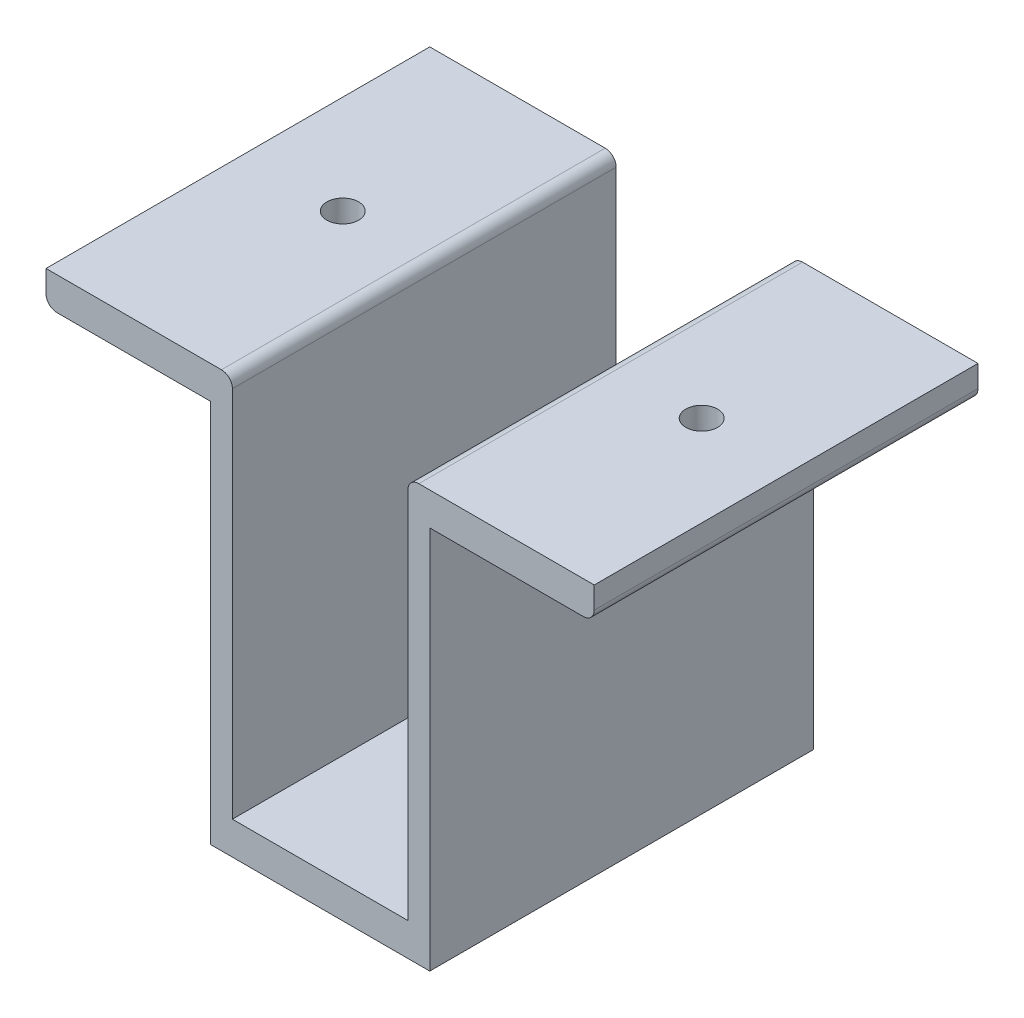
ISO-10303-21;
HEADER;
FILE_DESCRIPTION(('STEP AP214'),'2;1');
FILE_NAME('part.step','',(''),(''),'','','');
FILE_SCHEMA(('AUTOMOTIVE_DESIGN { 1 0 10303 214 1 1 1 1 }'));
ENDSEC;
DATA;
#1=APPLICATION_CONTEXT('core data for automotive mechanical design processes');
#2=APPLICATION_PROTOCOL_DEFINITION('international standard','automotive_design',2000,#1);
#3=PRODUCT_CONTEXT('',#1,'mechanical');
#4=PRODUCT('Part','Part','',(#3));
#5=PRODUCT_RELATED_PRODUCT_CATEGORY('part','',(#4));
#6=PRODUCT_DEFINITION_FORMATION('','',#4);
#7=PRODUCT_DEFINITION_CONTEXT('part definition',#1,'design');
#8=PRODUCT_DEFINITION('design','',#6,#7);
#9=PRODUCT_DEFINITION_SHAPE('','',#8);
#10=(LENGTH_UNIT() NAMED_UNIT(*) SI_UNIT(.MILLI.,.METRE.));
#11=(NAMED_UNIT(*) PLANE_ANGLE_UNIT() SI_UNIT($,.RADIAN.));
#12=(NAMED_UNIT(*) SI_UNIT($,.STERADIAN.) SOLID_ANGLE_UNIT());
#13=UNCERTAINTY_MEASURE_WITH_UNIT(LENGTH_MEASURE(1.E-05),#10,'distance_accuracy_value','');
#14=(GEOMETRIC_REPRESENTATION_CONTEXT(3) GLOBAL_UNCERTAINTY_ASSIGNED_CONTEXT((#13)) GLOBAL_UNIT_ASSIGNED_CONTEXT((#10,
#11,#12)) REPRESENTATION_CONTEXT('',''));
#15=CARTESIAN_POINT('',(0.,0.,0.));
#16=DIRECTION('',(0.,0.,1.));
#17=DIRECTION('',(1.,0.,0.));
#18=AXIS2_PLACEMENT_3D('',#15,#16,#17);
#19=CARTESIAN_POINT('',(0.,3.,0.));
#20=DIRECTION('',(0.,1.,0.));
#21=DIRECTION('',(0.,0.,1.));
#22=AXIS2_PLACEMENT_3D('',#19,#20,#21);
#23=PLANE('',#22);
#24=DIRECTION('',(0.,0.,1.));
#25=VECTOR('',#24,1.);
#26=CARTESIAN_POINT('',(17.9994477679851,3.,-19.887459807074));
#27=LINE('',#26,#25);
#28=CARTESIAN_POINT('',(17.9994477679851,3.,-17.8951929462717));
#29=VERTEX_POINT('',#28);
#30=CARTESIAN_POINT('',(17.9994477679851,3.,15.112540192926));
#31=VERTEX_POINT('',#30);
#32=EDGE_CURVE('E216',#29,#31,#27,.T.);
#33=ORIENTED_EDGE('',*,*,#32,.F.);
#34=DIRECTION('',(1.,0.,0.));
#35=VECTOR('',#34,1.);
#36=CARTESIAN_POINT('',(17.9994477679851,3.,-17.8951929462717));
#37=LINE('',#36,#35);
#38=CARTESIAN_POINT('',(2.,3.,-17.8951929462717));
#39=VERTEX_POINT('',#38);
#40=EDGE_CURVE('E263',#39,#29,#37,.T.);
#41=ORIENTED_EDGE('',*,*,#40,.F.);
#42=DIRECTION('',(0.,0.,-1.));
#43=VECTOR('',#42,1.);
#44=CARTESIAN_POINT('',(2.,3.,-19.887459807074));
#45=LINE('',#44,#43);
#46=CARTESIAN_POINT('',(2.,3.,15.112540192926));
#47=VERTEX_POINT('',#46);
#48=EDGE_CURVE('E186',#47,#39,#45,.T.);
#49=ORIENTED_EDGE('',*,*,#48,.F.);
#50=DIRECTION('',(1.,0.,0.));
#51=VECTOR('',#50,1.);
#52=CARTESIAN_POINT('',(0.,3.,15.112540192926));
#53=LINE('',#52,#51);
#54=EDGE_CURVE('E234',#47,#31,#53,.T.);
#55=ORIENTED_EDGE('',*,*,#54,.T.);
#56=EDGE_LOOP('',(#33,#41,#49,#55));
#57=FACE_BOUND('',#56,.T.);
#58=ADVANCED_FACE('F33',(#57),#23,.T.);
#59=CARTESIAN_POINT('',(2.,38.,-19.887459807074));
#60=DIRECTION('',(-1.,0.,0.));
#61=DIRECTION('',(0.,0.,1.));
#62=AXIS2_PLACEMENT_3D('',#59,#60,#61);
#63=PLANE('',#62);
#64=DIRECTION('',(0.,-1.,0.));
#65=VECTOR('',#64,1.);
#66=CARTESIAN_POINT('',(2.,38.,-19.887459807074));
#67=LINE('',#66,#65);
#68=CARTESIAN_POINT('',(2.,37.,-19.887459807074));
#69=VERTEX_POINT('',#68);
#70=CARTESIAN_POINT('',(2.,7.,-19.887459807074));
#71=VERTEX_POINT('',#70);
#72=EDGE_CURVE('E48',#69,#71,#67,.T.);
#73=ORIENTED_EDGE('',*,*,#72,.F.);
#74=DIRECTION('',(0.,0.,-1.));
#75=VECTOR('',#74,1.);
#76=CARTESIAN_POINT('',(2.,37.,15.112540192926));
#77=LINE('',#76,#75);
#78=CARTESIAN_POINT('',(2.,37.,15.112540192926));
#79=VERTEX_POINT('',#78);
#80=EDGE_CURVE('E294',#69,#79,#77,.F.);
#81=ORIENTED_EDGE('',*,*,#80,.T.);
#82=DIRECTION('',(0.,-1.,0.));
#83=VECTOR('',#82,1.);
#84=CARTESIAN_POINT('',(2.,38.,15.112540192926));
#85=LINE('',#84,#83);
#86=EDGE_CURVE('E231',#79,#47,#85,.T.);
#87=ORIENTED_EDGE('',*,*,#86,.T.);
#88=ORIENTED_EDGE('',*,*,#48,.T.);
#89=DIRECTION('',(0.,-1.,0.));
#90=VECTOR('',#89,1.);
#91=CARTESIAN_POINT('',(2.,8.,-17.8951929462717));
#92=LINE('',#91,#90);
#93=CARTESIAN_POINT('',(2.,8.,-17.8951929462717));
#94=VERTEX_POINT('',#93);
#95=EDGE_CURVE('E198',#94,#39,#92,.T.);
#96=ORIENTED_EDGE('',*,*,#95,.F.);
#97=DIRECTION('',(0.,0.,1.));
#98=VECTOR('',#97,1.);
#99=CARTESIAN_POINT('',(2.,8.,-19.887459807074));
#100=LINE('',#99,#98);
#101=CARTESIAN_POINT('',(2.,8.,-18.887459807074));
#102=VERTEX_POINT('',#101);
#103=EDGE_CURVE('E306',#102,#94,#100,.T.);
#104=ORIENTED_EDGE('',*,*,#103,.F.);
#105=CARTESIAN_POINT('',(2.,7.,-18.887459807074));
#106=DIRECTION('',(-1.,0.,0.));
#107=DIRECTION('',(0.,0.,1.));
#108=AXIS2_PLACEMENT_3D('',#105,#106,#107);
#109=CIRCLE('',#108,1.);
#110=EDGE_CURVE('E41',#102,#71,#109,.T.);
#111=ORIENTED_EDGE('',*,*,#110,.T.);
#112=EDGE_LOOP('',(#73,#81,#87,#88,#96,#104,#111));
#113=FACE_BOUND('',#112,.T.);
#114=ADVANCED_FACE('F303',(#113),#63,.F.);
#115=CARTESIAN_POINT('',(17.9994477679851,38.,-19.887459807074));
#116=DIRECTION('',(1.,0.,0.));
#117=DIRECTION('',(0.,0.,-1.));
#118=AXIS2_PLACEMENT_3D('',#115,#116,#117);
#119=PLANE('',#118);
#120=DIRECTION('',(0.,-1.,0.));
#121=VECTOR('',#120,1.);
#122=CARTESIAN_POINT('',(17.9994477679851,38.,15.112540192926));
#123=LINE('',#122,#121);
#124=CARTESIAN_POINT('',(17.9994477679851,37.,15.112540192926));
#125=VERTEX_POINT('',#124);
#126=EDGE_CURVE('E222',#125,#31,#123,.T.);
#127=ORIENTED_EDGE('',*,*,#126,.F.);
#128=DIRECTION('',(0.,0.,1.));
#129=VECTOR('',#128,1.);
#130=CARTESIAN_POINT('',(17.9994477679851,37.,-19.887459807074));
#131=LINE('',#130,#129);
#132=CARTESIAN_POINT('',(17.9994477679851,37.,-19.887459807074));
#133=VERTEX_POINT('',#132);
#134=EDGE_CURVE('E290',#125,#133,#131,.F.);
#135=ORIENTED_EDGE('',*,*,#134,.T.);
#136=DIRECTION('',(0.,-1.,0.));
#137=VECTOR('',#136,1.);
#138=CARTESIAN_POINT('',(17.9994477679851,38.,-19.887459807074));
#139=LINE('',#138,#137);
#140=CARTESIAN_POINT('',(17.9994477679851,7.,-19.887459807074));
#141=VERTEX_POINT('',#140);
#142=EDGE_CURVE('E55',#133,#141,#139,.T.);
#143=ORIENTED_EDGE('',*,*,#142,.T.);
#144=CARTESIAN_POINT('',(17.9994477679851,7.,-18.887459807074));
#145=DIRECTION('',(1.,0.,0.));
#146=DIRECTION('',(0.,0.,-1.));
#147=AXIS2_PLACEMENT_3D('',#144,#145,#146);
#148=CIRCLE('',#147,1.);
#149=CARTESIAN_POINT('',(17.9994477679851,8.,-18.887459807074));
#150=VERTEX_POINT('',#149);
#151=EDGE_CURVE('E11',#141,#150,#148,.T.);
#152=ORIENTED_EDGE('',*,*,#151,.T.);
#153=DIRECTION('',(0.,0.,-1.));
#154=VECTOR('',#153,1.);
#155=CARTESIAN_POINT('',(17.9994477679851,8.,-19.887459807074));
#156=LINE('',#155,#154);
#157=CARTESIAN_POINT('',(17.9994477679851,8.,-17.8951929462717));
#158=VERTEX_POINT('',#157);
#159=EDGE_CURVE('E367',#158,#150,#156,.T.);
#160=ORIENTED_EDGE('',*,*,#159,.F.);
#161=DIRECTION('',(0.,-1.,0.));
#162=VECTOR('',#161,1.);
#163=CARTESIAN_POINT('',(17.9994477679851,8.,-17.8951929462717));
#164=LINE('',#163,#162);
#165=EDGE_CURVE('E362',#158,#29,#164,.T.);
#166=ORIENTED_EDGE('',*,*,#165,.T.);
#167=ORIENTED_EDGE('',*,*,#32,.T.);
#168=EDGE_LOOP('',(#127,#135,#143,#152,#160,#166,#167));
#169=FACE_BOUND('',#168,.T.);
#170=ADVANCED_FACE('F399',(#169),#119,.F.);
#171=CARTESIAN_POINT('',(0.,3.,-19.887459807074));
#172=DIRECTION('',(1.,0.,0.));
#173=DIRECTION('',(0.,0.,-1.));
#174=AXIS2_PLACEMENT_3D('',#171,#172,#173);
#175=PLANE('',#174);
#176=DIRECTION('',(0.,0.,1.));
#177=VECTOR('',#176,1.);
#178=CARTESIAN_POINT('',(0.,35.0081400054375,-19.887459807074));
#179=LINE('',#178,#177);
#180=CARTESIAN_POINT('',(0.,35.0081400054375,-19.887459807074));
#181=VERTEX_POINT('',#180);
#182=CARTESIAN_POINT('',(0.,35.0081400054375,15.112540192926));
#183=VERTEX_POINT('',#182);
#184=EDGE_CURVE('E196',#181,#183,#179,.T.);
#185=ORIENTED_EDGE('',*,*,#184,.F.);
#186=DIRECTION('',(0.,-1.,0.));
#187=VECTOR('',#186,1.);
#188=CARTESIAN_POINT('',(0.,3.,-19.887459807074));
#189=LINE('',#188,#187);
#190=CARTESIAN_POINT('',(0.,0.,-19.887459807074));
#191=VERTEX_POINT('',#190);
#192=EDGE_CURVE('E237',#181,#191,#189,.T.);
#193=ORIENTED_EDGE('',*,*,#192,.T.);
#194=DIRECTION('',(0.,0.,1.));
#195=VECTOR('',#194,1.);
#196=CARTESIAN_POINT('',(0.,0.,-19.887459807074));
#197=LINE('',#196,#195);
#198=CARTESIAN_POINT('',(0.,0.,15.112540192926));
#199=VERTEX_POINT('',#198);
#200=EDGE_CURVE('E233',#191,#199,#197,.T.);
#201=ORIENTED_EDGE('',*,*,#200,.T.);
#202=DIRECTION('',(0.,-1.,0.));
#203=VECTOR('',#202,1.);
#204=CARTESIAN_POINT('',(0.,3.,15.112540192926));
#205=LINE('',#204,#203);
#206=EDGE_CURVE('E254',#183,#199,#205,.T.);
#207=ORIENTED_EDGE('',*,*,#206,.F.);
#208=EDGE_LOOP('',(#185,#193,#201,#207));
#209=FACE_BOUND('',#208,.T.);
#210=ADVANCED_FACE('F352',(#209),#175,.F.);
#211=CARTESIAN_POINT('',(20.,3.,-19.887459807074));
#212=DIRECTION('',(-1.,0.,0.));
#213=DIRECTION('',(0.,0.,1.));
#214=AXIS2_PLACEMENT_3D('',#211,#212,#213);
#215=PLANE('',#214);
#216=DIRECTION('',(0.,0.,-1.));
#217=VECTOR('',#216,1.);
#218=CARTESIAN_POINT('',(20.,35.0081400054375,15.112540192926));
#219=LINE('',#218,#217);
#220=CARTESIAN_POINT('',(20.,35.0081400054375,15.112540192926));
#221=VERTEX_POINT('',#220);
#222=CARTESIAN_POINT('',(20.,35.0081400054375,-19.887459807074));
#223=VERTEX_POINT('',#222);
#224=EDGE_CURVE('E201',#221,#223,#219,.T.);
#225=ORIENTED_EDGE('',*,*,#224,.F.);
#226=DIRECTION('',(0.,-1.,0.));
#227=VECTOR('',#226,1.);
#228=CARTESIAN_POINT('',(20.,3.,15.112540192926));
#229=LINE('',#228,#227);
#230=CARTESIAN_POINT('',(20.,0.,15.112540192926));
#231=VERTEX_POINT('',#230);
#232=EDGE_CURVE('E252',#221,#231,#229,.T.);
#233=ORIENTED_EDGE('',*,*,#232,.T.);
#234=DIRECTION('',(0.,0.,-1.));
#235=VECTOR('',#234,1.);
#236=CARTESIAN_POINT('',(20.,0.,-19.887459807074));
#237=LINE('',#236,#235);
#238=CARTESIAN_POINT('',(20.,0.,-19.887459807074));
#239=VERTEX_POINT('',#238);
#240=EDGE_CURVE('E244',#231,#239,#237,.T.);
#241=ORIENTED_EDGE('',*,*,#240,.T.);
#242=DIRECTION('',(0.,-1.,0.));
#243=VECTOR('',#242,1.);
#244=CARTESIAN_POINT('',(20.,3.,-19.887459807074));
#245=LINE('',#244,#243);
#246=EDGE_CURVE('E250',#223,#239,#245,.T.);
#247=ORIENTED_EDGE('',*,*,#246,.F.);
#248=EDGE_LOOP('',(#225,#233,#241,#247));
#249=FACE_BOUND('',#248,.T.);
#250=ADVANCED_FACE('F339',(#249),#215,.F.);
#251=CARTESIAN_POINT('',(0.,3.,15.112540192926));
#252=DIRECTION('',(0.,0.,-1.));
#253=DIRECTION('',(-1.,0.,0.));
#254=AXIS2_PLACEMENT_3D('',#251,#252,#253);
#255=PLANE('',#254);
#256=DIRECTION('',(0.,1.,0.));
#257=VECTOR('',#256,1.);
#258=CARTESIAN_POINT('',(-15.,38.,15.112540192926));
#259=LINE('',#258,#257);
#260=CARTESIAN_POINT('',(-15.,36.0081400054375,15.112540192926));
#261=VERTEX_POINT('',#260);
#262=CARTESIAN_POINT('',(-15.,38.,15.112540192926));
#263=VERTEX_POINT('',#262);
#264=EDGE_CURVE('E164',#261,#263,#259,.T.);
#265=ORIENTED_EDGE('',*,*,#264,.F.);
#266=CARTESIAN_POINT('',(-14.,36.0081400054375,15.112540192926));
#267=DIRECTION('',(0.,0.,-1.));
#268=DIRECTION('',(-1.,0.,0.));
#269=AXIS2_PLACEMENT_3D('',#266,#267,#268);
#270=CIRCLE('',#269,1.);
#271=CARTESIAN_POINT('',(-14.,35.0081400054375,15.112540192926));
#272=VERTEX_POINT('',#271);
#273=EDGE_CURVE('E270',#261,#272,#270,.F.);
#274=ORIENTED_EDGE('',*,*,#273,.T.);
#275=DIRECTION('',(1.,0.,0.));
#276=VECTOR('',#275,1.);
#277=CARTESIAN_POINT('',(-15.,35.0081400054375,15.112540192926));
#278=LINE('',#277,#276);
#279=EDGE_CURVE('E190',#272,#183,#278,.T.);
#280=ORIENTED_EDGE('',*,*,#279,.T.);
#281=ORIENTED_EDGE('',*,*,#206,.T.);
#282=DIRECTION('',(1.,0.,0.));
#283=VECTOR('',#282,1.);
#284=CARTESIAN_POINT('',(0.,0.,15.112540192926));
#285=LINE('',#284,#283);
#286=EDGE_CURVE('E241',#199,#231,#285,.T.);
#287=ORIENTED_EDGE('',*,*,#286,.T.);
#288=ORIENTED_EDGE('',*,*,#232,.F.);
#289=DIRECTION('',(-1.,0.,0.));
#290=VECTOR('',#289,1.);
#291=CARTESIAN_POINT('',(35.,35.0081400054375,15.112540192926));
#292=LINE('',#291,#290);
#293=CARTESIAN_POINT('',(34.,35.0081400054375,15.112540192926));
#294=VERTEX_POINT('',#293);
#295=EDGE_CURVE('E214',#294,#221,#292,.T.);
#296=ORIENTED_EDGE('',*,*,#295,.F.);
#297=CARTESIAN_POINT('',(34.,36.0081400054375,15.112540192926));
#298=DIRECTION('',(0.,0.,-1.));
#299=DIRECTION('',(-1.,0.,0.));
#300=AXIS2_PLACEMENT_3D('',#297,#298,#299);
#301=CIRCLE('',#300,1.);
#302=CARTESIAN_POINT('',(35.,36.0081400054375,15.112540192926));
#303=VERTEX_POINT('',#302);
#304=EDGE_CURVE('E268',#294,#303,#301,.F.);
#305=ORIENTED_EDGE('',*,*,#304,.T.);
#306=DIRECTION('',(0.,-1.,0.));
#307=VECTOR('',#306,1.);
#308=CARTESIAN_POINT('',(35.,38.,15.112540192926));
#309=LINE('',#308,#307);
#310=CARTESIAN_POINT('',(35.,38.,15.112540192926));
#311=VERTEX_POINT('',#310);
#312=EDGE_CURVE('E202',#311,#303,#309,.T.);
#313=ORIENTED_EDGE('',*,*,#312,.F.);
#314=DIRECTION('',(1.,0.,0.));
#315=VECTOR('',#314,1.);
#316=CARTESIAN_POINT('',(20.,38.,15.112540192926));
#317=LINE('',#316,#315);
#318=CARTESIAN_POINT('',(18.9994477679851,38.,15.112540192926));
#319=VERTEX_POINT('',#318);
#320=EDGE_CURVE('E220',#319,#311,#317,.T.);
#321=ORIENTED_EDGE('',*,*,#320,.F.);
#322=CARTESIAN_POINT('',(18.9994477679851,37.,15.112540192926));
#323=DIRECTION('',(0.,0.,-1.));
#324=DIRECTION('',(-1.,0.,0.));
#325=AXIS2_PLACEMENT_3D('',#322,#323,#324);
#326=CIRCLE('',#325,1.);
#327=EDGE_CURVE('E266',#319,#125,#326,.F.);
#328=ORIENTED_EDGE('',*,*,#327,.T.);
#329=ORIENTED_EDGE('',*,*,#126,.T.);
#330=ORIENTED_EDGE('',*,*,#54,.F.);
#331=ORIENTED_EDGE('',*,*,#86,.F.);
#332=CARTESIAN_POINT('',(1.,37.,15.112540192926));
#333=DIRECTION('',(0.,0.,-1.));
#334=DIRECTION('',(-1.,0.,0.));
#335=AXIS2_PLACEMENT_3D('',#332,#333,#334);
#336=CIRCLE('',#335,1.);
#337=CARTESIAN_POINT('',(1.,38.,15.112540192926));
#338=VERTEX_POINT('',#337);
#339=EDGE_CURVE('E181',#79,#338,#336,.F.);
#340=ORIENTED_EDGE('',*,*,#339,.T.);
#341=DIRECTION('',(1.,0.,0.));
#342=VECTOR('',#341,1.);
#343=CARTESIAN_POINT('',(0.,38.,15.112540192926));
#344=LINE('',#343,#342);
#345=EDGE_CURVE('E177',#263,#338,#344,.T.);
#346=ORIENTED_EDGE('',*,*,#345,.F.);
#347=EDGE_LOOP('',(#265,#274,#280,#281,#287,#288,#296,#305,#313,#321,#328,#329,#330,#331,#340,#346));
#348=FACE_BOUND('',#347,.T.);
#349=ADVANCED_FACE('F178',(#348),#255,.F.);
#350=CARTESIAN_POINT('',(0.,3.,-19.887459807074));
#351=DIRECTION('',(0.,0.,1.));
#352=DIRECTION('',(1.,0.,0.));
#353=AXIS2_PLACEMENT_3D('',#350,#351,#352);
#354=PLANE('',#353);
#355=ORIENTED_EDGE('',*,*,#72,.T.);
#356=DIRECTION('',(-1.,0.,0.));
#357=VECTOR('',#356,1.);
#358=CARTESIAN_POINT('',(0.,7.,-19.887459807074));
#359=LINE('',#358,#357);
#360=EDGE_CURVE('E299',#71,#141,#359,.F.);
#361=ORIENTED_EDGE('',*,*,#360,.T.);
#362=ORIENTED_EDGE('',*,*,#142,.F.);
#363=CARTESIAN_POINT('',(18.9994477679851,37.,-19.887459807074));
#364=DIRECTION('',(0.,0.,1.));
#365=DIRECTION('',(1.,0.,0.));
#366=AXIS2_PLACEMENT_3D('',#363,#364,#365);
#367=CIRCLE('',#366,1.);
#368=CARTESIAN_POINT('',(18.9994477679851,38.,-19.887459807074));
#369=VERTEX_POINT('',#368);
#370=EDGE_CURVE('E276',#133,#369,#367,.F.);
#371=ORIENTED_EDGE('',*,*,#370,.T.);
#372=DIRECTION('',(-1.,0.,0.));
#373=VECTOR('',#372,1.);
#374=CARTESIAN_POINT('',(20.,38.,-19.887459807074));
#375=LINE('',#374,#373);
#376=CARTESIAN_POINT('',(35.,38.,-19.887459807074));
#377=VERTEX_POINT('',#376);
#378=EDGE_CURVE('E217',#377,#369,#375,.T.);
#379=ORIENTED_EDGE('',*,*,#378,.F.);
#380=DIRECTION('',(0.,1.,0.));
#381=VECTOR('',#380,1.);
#382=CARTESIAN_POINT('',(35.,38.,-19.887459807074));
#383=LINE('',#382,#381);
#384=CARTESIAN_POINT('',(35.,36.0081400054375,-19.887459807074));
#385=VERTEX_POINT('',#384);
#386=EDGE_CURVE('E205',#385,#377,#383,.T.);
#387=ORIENTED_EDGE('',*,*,#386,.F.);
#388=CARTESIAN_POINT('',(34.,36.0081400054375,-19.887459807074));
#389=DIRECTION('',(0.,0.,1.));
#390=DIRECTION('',(1.,0.,0.));
#391=AXIS2_PLACEMENT_3D('',#388,#389,#390);
#392=CIRCLE('',#391,1.);
#393=CARTESIAN_POINT('',(34.,35.0081400054375,-19.887459807074));
#394=VERTEX_POINT('',#393);
#395=EDGE_CURVE('E278',#385,#394,#392,.F.);
#396=ORIENTED_EDGE('',*,*,#395,.T.);
#397=DIRECTION('',(-1.,0.,0.));
#398=VECTOR('',#397,1.);
#399=CARTESIAN_POINT('',(35.,35.0081400054375,-19.887459807074));
#400=LINE('',#399,#398);
#401=EDGE_CURVE('E210',#394,#223,#400,.T.);
#402=ORIENTED_EDGE('',*,*,#401,.T.);
#403=ORIENTED_EDGE('',*,*,#246,.T.);
#404=DIRECTION('',(-1.,0.,0.));
#405=VECTOR('',#404,1.);
#406=CARTESIAN_POINT('',(0.,0.,-19.887459807074));
#407=LINE('',#406,#405);
#408=EDGE_CURVE('E238',#239,#191,#407,.T.);
#409=ORIENTED_EDGE('',*,*,#408,.T.);
#410=ORIENTED_EDGE('',*,*,#192,.F.);
#411=DIRECTION('',(1.,0.,0.));
#412=VECTOR('',#411,1.);
#413=CARTESIAN_POINT('',(-15.,35.0081400054375,-19.887459807074));
#414=LINE('',#413,#412);
#415=CARTESIAN_POINT('',(-14.,35.0081400054375,-19.887459807074));
#416=VERTEX_POINT('',#415);
#417=EDGE_CURVE('E192',#416,#181,#414,.T.);
#418=ORIENTED_EDGE('',*,*,#417,.F.);
#419=CARTESIAN_POINT('',(-14.,36.0081400054375,-19.887459807074));
#420=DIRECTION('',(0.,0.,1.));
#421=DIRECTION('',(1.,0.,0.));
#422=AXIS2_PLACEMENT_3D('',#419,#420,#421);
#423=CIRCLE('',#422,1.);
#424=CARTESIAN_POINT('',(-15.,36.0081400054375,-19.887459807074));
#425=VERTEX_POINT('',#424);
#426=EDGE_CURVE('E280',#416,#425,#423,.F.);
#427=ORIENTED_EDGE('',*,*,#426,.T.);
#428=DIRECTION('',(0.,-1.,0.));
#429=VECTOR('',#428,1.);
#430=CARTESIAN_POINT('',(-15.,38.,-19.887459807074));
#431=LINE('',#430,#429);
#432=CARTESIAN_POINT('',(-15.,38.,-19.887459807074));
#433=VERTEX_POINT('',#432);
#434=EDGE_CURVE('E174',#433,#425,#431,.T.);
#435=ORIENTED_EDGE('',*,*,#434,.F.);
#436=DIRECTION('',(-1.,0.,0.));
#437=VECTOR('',#436,1.);
#438=CARTESIAN_POINT('',(0.,38.,-19.887459807074));
#439=LINE('',#438,#437);
#440=CARTESIAN_POINT('',(1.,38.,-19.887459807074));
#441=VERTEX_POINT('',#440);
#442=EDGE_CURVE('E185',#441,#433,#439,.T.);
#443=ORIENTED_EDGE('',*,*,#442,.F.);
#444=CARTESIAN_POINT('',(1.,37.,-19.887459807074));
#445=DIRECTION('',(0.,0.,1.));
#446=DIRECTION('',(1.,0.,0.));
#447=AXIS2_PLACEMENT_3D('',#444,#445,#446);
#448=CIRCLE('',#447,1.);
#449=EDGE_CURVE('E274',#441,#69,#448,.F.);
#450=ORIENTED_EDGE('',*,*,#449,.T.);
#451=EDGE_LOOP('',(#355,#361,#362,#371,#379,#387,#396,#402,#403,#409,#410,#418,#427,#435,#443,#450));
#452=FACE_BOUND('',#451,.T.);
#453=ADVANCED_FACE('F310',(#452),#354,.F.);
#454=CARTESIAN_POINT('',(0.,0.,0.));
#455=DIRECTION('',(0.,1.,0.));
#456=DIRECTION('',(0.,0.,1.));
#457=AXIS2_PLACEMENT_3D('',#454,#455,#456);
#458=PLANE('',#457);
#459=ORIENTED_EDGE('',*,*,#200,.F.);
#460=ORIENTED_EDGE('',*,*,#408,.F.);
#461=ORIENTED_EDGE('',*,*,#240,.F.);
#462=ORIENTED_EDGE('',*,*,#286,.F.);
#463=EDGE_LOOP('',(#459,#460,#461,#462));
#464=FACE_BOUND('',#463,.T.);
#465=ADVANCED_FACE('F346',(#464),#458,.F.);
#466=CARTESIAN_POINT('',(0.,38.,0.));
#467=DIRECTION('',(0.,1.,0.));
#468=DIRECTION('',(0.,0.,1.));
#469=AXIS2_PLACEMENT_3D('',#466,#467,#468);
#470=PLANE('',#469);
#471=CARTESIAN_POINT('',(-6.00207216619672,38.,-2.95549309832886));
#472=DIRECTION('',(0.,1.,0.));
#473=DIRECTION('',(0.,0.,1.));
#474=AXIS2_PLACEMENT_3D('',#471,#472,#473);
#475=CIRCLE('',#474,1.45);
#476=CARTESIAN_POINT('',(-6.00207216619672,38.,-1.50549309832886));
#477=VERTEX_POINT('',#476);
#478=EDGE_CURVE('E260',#477,#477,#475,.T.);
#479=ORIENTED_EDGE('',*,*,#478,.F.);
#480=EDGE_LOOP('',(#479));
#481=FACE_BOUND('',#480,.T.);
#482=ORIENTED_EDGE('',*,*,#345,.T.);
#483=DIRECTION('',(0.,0.,-1.));
#484=VECTOR('',#483,1.);
#485=CARTESIAN_POINT('',(1.,38.,-19.887459807074));
#486=LINE('',#485,#484);
#487=EDGE_CURVE('E292',#338,#441,#486,.T.);
#488=ORIENTED_EDGE('',*,*,#487,.T.);
#489=ORIENTED_EDGE('',*,*,#442,.T.);
#490=DIRECTION('',(0.,0.,-1.));
#491=VECTOR('',#490,1.);
#492=CARTESIAN_POINT('',(-15.,38.,-19.887459807074));
#493=LINE('',#492,#491);
#494=EDGE_CURVE('E169',#263,#433,#493,.T.);
#495=ORIENTED_EDGE('',*,*,#494,.F.);
#496=EDGE_LOOP('',(#482,#488,#489,#495));
#497=FACE_BOUND('',#496,.T.);
#498=ADVANCED_FACE('F188',(#481,#497),#470,.T.);
#499=CARTESIAN_POINT('',(0.,38.,0.));
#500=DIRECTION('',(0.,-1.,0.));
#501=DIRECTION('',(0.,0.,-1.));
#502=AXIS2_PLACEMENT_3D('',#499,#500,#501);
#503=PLANE('',#502);
#504=CARTESIAN_POINT('',(26.7304321433144,38.,-2.95549309832886));
#505=DIRECTION('',(0.,1.,0.));
#506=DIRECTION('',(0.,0.,1.));
#507=AXIS2_PLACEMENT_3D('',#504,#505,#506);
#508=CIRCLE('',#507,1.45);
#509=CARTESIAN_POINT('',(26.7304321433144,38.,-1.50549309832886));
#510=VERTEX_POINT('',#509);
#511=EDGE_CURVE('E373',#510,#510,#508,.T.);
#512=ORIENTED_EDGE('',*,*,#511,.F.);
#513=EDGE_LOOP('',(#512));
#514=FACE_BOUND('',#513,.T.);
#515=ORIENTED_EDGE('',*,*,#378,.T.);
#516=DIRECTION('',(0.,0.,1.));
#517=VECTOR('',#516,1.);
#518=CARTESIAN_POINT('',(18.9994477679851,38.,0.));
#519=LINE('',#518,#517);
#520=EDGE_CURVE('E287',#369,#319,#519,.T.);
#521=ORIENTED_EDGE('',*,*,#520,.T.);
#522=ORIENTED_EDGE('',*,*,#320,.T.);
#523=DIRECTION('',(0.,0.,1.));
#524=VECTOR('',#523,1.);
#525=CARTESIAN_POINT('',(35.,38.,15.112540192926));
#526=LINE('',#525,#524);
#527=EDGE_CURVE('E207',#377,#311,#526,.T.);
#528=ORIENTED_EDGE('',*,*,#527,.F.);
#529=EDGE_LOOP('',(#515,#521,#522,#528));
#530=FACE_BOUND('',#529,.T.);
#531=ADVANCED_FACE('F319',(#514,#530),#503,.F.);
#532=CARTESIAN_POINT('',(35.,35.0081400054375,15.112540192926));
#533=DIRECTION('',(0.,1.,0.));
#534=DIRECTION('',(0.,0.,1.));
#535=AXIS2_PLACEMENT_3D('',#532,#533,#534);
#536=PLANE('',#535);
#537=CARTESIAN_POINT('',(26.7304321433144,35.0081400054375,-2.95549309832886));
#538=DIRECTION('',(0.,1.,0.));
#539=DIRECTION('',(0.,0.,1.));
#540=AXIS2_PLACEMENT_3D('',#537,#538,#539);
#541=CIRCLE('',#540,1.45);
#542=CARTESIAN_POINT('',(26.7304321433144,35.0081400054375,-1.50549309832886));
#543=VERTEX_POINT('',#542);
#544=EDGE_CURVE('E259',#543,#543,#541,.T.);
#545=ORIENTED_EDGE('',*,*,#544,.T.);
#546=EDGE_LOOP('',(#545));
#547=FACE_BOUND('',#546,.T.);
#548=ORIENTED_EDGE('',*,*,#401,.F.);
#549=DIRECTION('',(0.,0.,-1.));
#550=VECTOR('',#549,1.);
#551=CARTESIAN_POINT('',(34.,35.0081400054375,15.112540192926));
#552=LINE('',#551,#550);
#553=EDGE_CURVE('E285',#394,#294,#552,.F.);
#554=ORIENTED_EDGE('',*,*,#553,.T.);
#555=ORIENTED_EDGE('',*,*,#295,.T.);
#556=ORIENTED_EDGE('',*,*,#224,.T.);
#557=EDGE_LOOP('',(#548,#554,#555,#556));
#558=FACE_BOUND('',#557,.T.);
#559=ADVANCED_FACE('F335',(#547,#558),#536,.F.);
#560=CARTESIAN_POINT('',(35.,0.,0.));
#561=DIRECTION('',(1.,0.,0.));
#562=DIRECTION('',(0.,0.,-1.));
#563=AXIS2_PLACEMENT_3D('',#560,#561,#562);
#564=PLANE('',#563);
#565=ORIENTED_EDGE('',*,*,#312,.T.);
#566=DIRECTION('',(0.,0.,-1.));
#567=VECTOR('',#566,1.);
#568=CARTESIAN_POINT('',(35.,36.0081400054375,-19.887459807074));
#569=LINE('',#568,#567);
#570=EDGE_CURVE('E282',#303,#385,#569,.T.);
#571=ORIENTED_EDGE('',*,*,#570,.T.);
#572=ORIENTED_EDGE('',*,*,#386,.T.);
#573=ORIENTED_EDGE('',*,*,#527,.T.);
#574=EDGE_LOOP('',(#565,#571,#572,#573));
#575=FACE_BOUND('',#574,.T.);
#576=ADVANCED_FACE('F327',(#575),#564,.T.);
#577=CARTESIAN_POINT('',(-15.,35.0081400054375,-19.887459807074));
#578=DIRECTION('',(0.,1.,0.));
#579=DIRECTION('',(0.,0.,1.));
#580=AXIS2_PLACEMENT_3D('',#577,#578,#579);
#581=PLANE('',#580);
#582=CARTESIAN_POINT('',(-6.00207216619672,35.0081400054375,-2.95549309832886));
#583=DIRECTION('',(0.,1.,0.));
#584=DIRECTION('',(0.,0.,1.));
#585=AXIS2_PLACEMENT_3D('',#582,#583,#584);
#586=CIRCLE('',#585,1.45);
#587=CARTESIAN_POINT('',(-6.00207216619672,35.0081400054375,-1.50549309832886));
#588=VERTEX_POINT('',#587);
#589=EDGE_CURVE('E256',#588,#588,#586,.T.);
#590=ORIENTED_EDGE('',*,*,#589,.T.);
#591=EDGE_LOOP('',(#590));
#592=FACE_BOUND('',#591,.T.);
#593=ORIENTED_EDGE('',*,*,#279,.F.);
#594=DIRECTION('',(0.,0.,1.));
#595=VECTOR('',#594,1.);
#596=CARTESIAN_POINT('',(-14.,35.0081400054375,-19.887459807074));
#597=LINE('',#596,#595);
#598=EDGE_CURVE('E272',#272,#416,#597,.F.);
#599=ORIENTED_EDGE('',*,*,#598,.T.);
#600=ORIENTED_EDGE('',*,*,#417,.T.);
#601=ORIENTED_EDGE('',*,*,#184,.T.);
#602=EDGE_LOOP('',(#593,#599,#600,#601));
#603=FACE_BOUND('',#602,.T.);
#604=ADVANCED_FACE('F355',(#592,#603),#581,.F.);
#605=CARTESIAN_POINT('',(-15.,0.,0.));
#606=DIRECTION('',(-1.,0.,0.));
#607=DIRECTION('',(0.,0.,1.));
#608=AXIS2_PLACEMENT_3D('',#605,#606,#607);
#609=PLANE('',#608);
#610=ORIENTED_EDGE('',*,*,#434,.T.);
#611=DIRECTION('',(0.,0.,1.));
#612=VECTOR('',#611,1.);
#613=CARTESIAN_POINT('',(-15.,36.0081400054375,15.112540192926));
#614=LINE('',#613,#612);
#615=EDGE_CURVE('E172',#425,#261,#614,.T.);
#616=ORIENTED_EDGE('',*,*,#615,.T.);
#617=ORIENTED_EDGE('',*,*,#264,.T.);
#618=ORIENTED_EDGE('',*,*,#494,.T.);
#619=EDGE_LOOP('',(#610,#616,#617,#618));
#620=FACE_BOUND('',#619,.T.);
#621=ADVANCED_FACE('F167',(#620),#609,.T.);
#622=CARTESIAN_POINT('',(17.9994477679851,8.,-17.8951929462717));
#623=DIRECTION('',(0.,0.,-1.));
#624=DIRECTION('',(-1.,0.,0.));
#625=AXIS2_PLACEMENT_3D('',#622,#623,#624);
#626=PLANE('',#625);
#627=ORIENTED_EDGE('',*,*,#40,.T.);
#628=ORIENTED_EDGE('',*,*,#165,.F.);
#629=DIRECTION('',(1.,0.,0.));
#630=VECTOR('',#629,1.);
#631=CARTESIAN_POINT('',(17.9994477679851,8.,-17.8951929462717));
#632=LINE('',#631,#630);
#633=EDGE_CURVE('E364',#94,#158,#632,.T.);
#634=ORIENTED_EDGE('',*,*,#633,.F.);
#635=ORIENTED_EDGE('',*,*,#95,.T.);
#636=EDGE_LOOP('',(#627,#628,#634,#635));
#637=FACE_BOUND('',#636,.T.);
#638=ADVANCED_FACE('F426',(#637),#626,.F.);
#639=CARTESIAN_POINT('',(0.,8.,0.));
#640=DIRECTION('',(0.,-1.,0.));
#641=DIRECTION('',(0.,0.,-1.));
#642=AXIS2_PLACEMENT_3D('',#639,#640,#641);
#643=PLANE('',#642);
#644=ORIENTED_EDGE('',*,*,#159,.T.);
#645=DIRECTION('',(-1.,0.,0.));
#646=VECTOR('',#645,1.);
#647=CARTESIAN_POINT('',(0.,8.,-18.887459807074));
#648=LINE('',#647,#646);
#649=EDGE_CURVE('E296',#150,#102,#648,.T.);
#650=ORIENTED_EDGE('',*,*,#649,.T.);
#651=ORIENTED_EDGE('',*,*,#103,.T.);
#652=ORIENTED_EDGE('',*,*,#633,.T.);
#653=EDGE_LOOP('',(#644,#650,#651,#652));
#654=FACE_BOUND('',#653,.T.);
#655=ADVANCED_FACE('F429',(#654),#643,.F.);
#656=CARTESIAN_POINT('',(-6.00207216619672,0.,-2.95549309832886));
#657=DIRECTION('',(0.,1.,0.));
#658=DIRECTION('',(0.,0.,1.));
#659=AXIS2_PLACEMENT_3D('',#656,#657,#658);
#660=CYLINDRICAL_SURFACE('',#659,1.45);
#661=ORIENTED_EDGE('',*,*,#478,.T.);
#662=EDGE_LOOP('',(#661));
#663=FACE_BOUND('',#662,.T.);
#664=ORIENTED_EDGE('',*,*,#589,.F.);
#665=EDGE_LOOP('',(#664));
#666=FACE_BOUND('',#665,.T.);
#667=ADVANCED_FACE('F379',(#663,#666),#660,.F.);
#668=CARTESIAN_POINT('',(26.7304321433144,0.,-2.95549309832886));
#669=DIRECTION('',(0.,1.,0.));
#670=DIRECTION('',(0.,0.,1.));
#671=AXIS2_PLACEMENT_3D('',#668,#669,#670);
#672=CYLINDRICAL_SURFACE('',#671,1.45);
#673=ORIENTED_EDGE('',*,*,#511,.T.);
#674=EDGE_LOOP('',(#673));
#675=FACE_BOUND('',#674,.T.);
#676=ORIENTED_EDGE('',*,*,#544,.F.);
#677=EDGE_LOOP('',(#676));
#678=FACE_BOUND('',#677,.T.);
#679=ADVANCED_FACE('F412',(#675,#678),#672,.F.);
#680=CARTESIAN_POINT('',(-14.,36.0081400054375,0.));
#681=DIRECTION('',(0.,0.,-1.));
#682=DIRECTION('',(-1.,0.,0.));
#683=AXIS2_PLACEMENT_3D('',#680,#681,#682);
#684=CYLINDRICAL_SURFACE('',#683,1.);
#685=ORIENTED_EDGE('',*,*,#426,.F.);
#686=ORIENTED_EDGE('',*,*,#598,.F.);
#687=ORIENTED_EDGE('',*,*,#273,.F.);
#688=ORIENTED_EDGE('',*,*,#615,.F.);
#689=EDGE_LOOP('',(#685,#686,#687,#688));
#690=FACE_BOUND('',#689,.T.);
#691=ADVANCED_FACE('F358',(#690),#684,.T.);
#692=CARTESIAN_POINT('',(34.,36.0081400054375,0.));
#693=DIRECTION('',(0.,0.,1.));
#694=DIRECTION('',(1.,0.,0.));
#695=AXIS2_PLACEMENT_3D('',#692,#693,#694);
#696=CYLINDRICAL_SURFACE('',#695,1.);
#697=ORIENTED_EDGE('',*,*,#304,.F.);
#698=ORIENTED_EDGE('',*,*,#553,.F.);
#699=ORIENTED_EDGE('',*,*,#395,.F.);
#700=ORIENTED_EDGE('',*,*,#570,.F.);
#701=EDGE_LOOP('',(#697,#698,#699,#700));
#702=FACE_BOUND('',#701,.T.);
#703=ADVANCED_FACE('F330',(#702),#696,.T.);
#704=CARTESIAN_POINT('',(18.9994477679851,37.,0.));
#705=DIRECTION('',(0.,0.,1.));
#706=DIRECTION('',(1.,0.,0.));
#707=AXIS2_PLACEMENT_3D('',#704,#705,#706);
#708=CYLINDRICAL_SURFACE('',#707,1.);
#709=ORIENTED_EDGE('',*,*,#370,.F.);
#710=ORIENTED_EDGE('',*,*,#134,.F.);
#711=ORIENTED_EDGE('',*,*,#327,.F.);
#712=ORIENTED_EDGE('',*,*,#520,.F.);
#713=EDGE_LOOP('',(#709,#710,#711,#712));
#714=FACE_BOUND('',#713,.T.);
#715=ADVANCED_FACE('F316',(#714),#708,.T.);
#716=CARTESIAN_POINT('',(1.,37.,0.));
#717=DIRECTION('',(0.,0.,1.));
#718=DIRECTION('',(1.,0.,0.));
#719=AXIS2_PLACEMENT_3D('',#716,#717,#718);
#720=CYLINDRICAL_SURFACE('',#719,1.);
#721=ORIENTED_EDGE('',*,*,#339,.F.);
#722=ORIENTED_EDGE('',*,*,#80,.F.);
#723=ORIENTED_EDGE('',*,*,#449,.F.);
#724=ORIENTED_EDGE('',*,*,#487,.F.);
#725=EDGE_LOOP('',(#721,#722,#723,#724));
#726=FACE_BOUND('',#725,.T.);
#727=ADVANCED_FACE('F416',(#726),#720,.T.);
#728=CARTESIAN_POINT('',(0.,7.,-18.887459807074));
#729=DIRECTION('',(-1.,0.,0.));
#730=DIRECTION('',(0.,0.,1.));
#731=AXIS2_PLACEMENT_3D('',#728,#729,#730);
#732=CYLINDRICAL_SURFACE('',#731,1.);
#733=ORIENTED_EDGE('',*,*,#151,.F.);
#734=ORIENTED_EDGE('',*,*,#360,.F.);
#735=ORIENTED_EDGE('',*,*,#110,.F.);
#736=ORIENTED_EDGE('',*,*,#649,.F.);
#737=EDGE_LOOP('',(#733,#734,#735,#736));
#738=FACE_BOUND('',#737,.T.);
#739=ADVANCED_FACE('F35',(#738),#732,.T.);
#740=CLOSED_SHELL('',(#58,#114,#170,#210,#250,#349,#453,#465,#498,#531,#559,#576,#604,#621,#638,
#655,#667,#679,#691,#703,#715,#727,#739));
#741=MANIFOLD_SOLID_BREP('B2',#740);
#742=ADVANCED_BREP_SHAPE_REPRESENTATION('',(#18,#741),#14);
#743=SHAPE_DEFINITION_REPRESENTATION(#9,#742);
ENDSEC;
END-ISO-10303-21;
